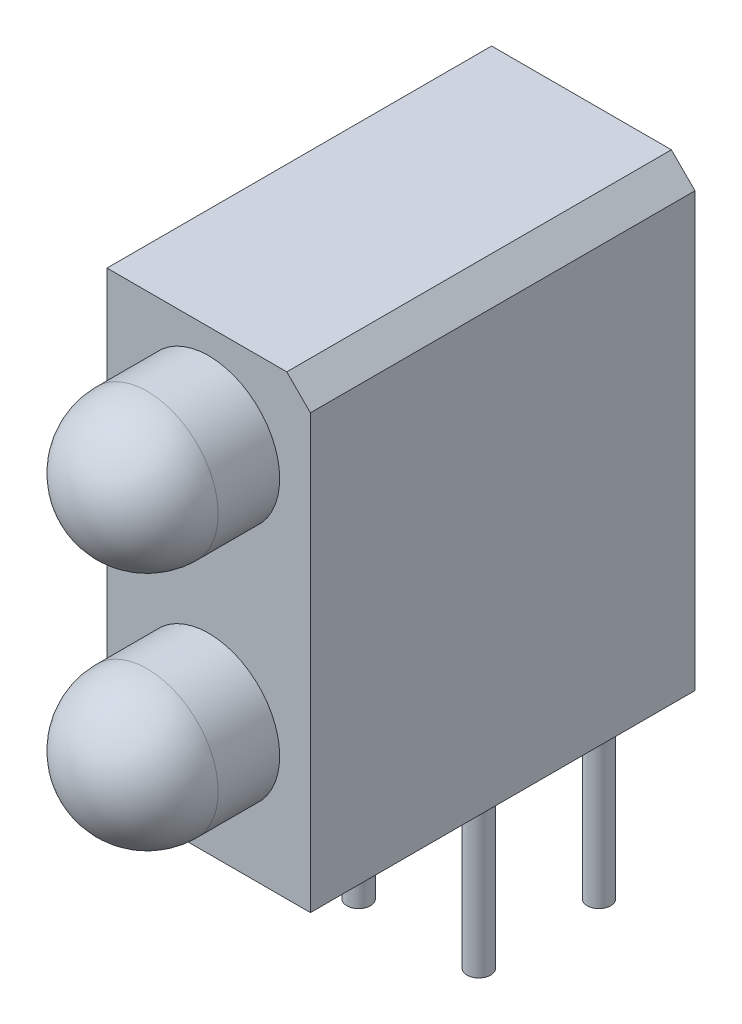
ISO-10303-21;
HEADER;
FILE_DESCRIPTION(('STEP AP214'),'2;1');
FILE_NAME('part.step','',(''),(''),'','','');
FILE_SCHEMA(('AUTOMOTIVE_DESIGN { 1 0 10303 214 1 1 1 1 }'));
ENDSEC;
DATA;
#1=APPLICATION_CONTEXT('core data for automotive mechanical design processes');
#2=APPLICATION_PROTOCOL_DEFINITION('international standard','automotive_design',2000,#1);
#3=PRODUCT_CONTEXT('',#1,'mechanical');
#4=PRODUCT('Part','Part','',(#3));
#5=PRODUCT_RELATED_PRODUCT_CATEGORY('part','',(#4));
#6=PRODUCT_DEFINITION_FORMATION('','',#4);
#7=PRODUCT_DEFINITION_CONTEXT('part definition',#1,'design');
#8=PRODUCT_DEFINITION('design','',#6,#7);
#9=PRODUCT_DEFINITION_SHAPE('','',#8);
#10=(LENGTH_UNIT() NAMED_UNIT(*) SI_UNIT(.MILLI.,.METRE.));
#11=(NAMED_UNIT(*) PLANE_ANGLE_UNIT() SI_UNIT($,.RADIAN.));
#12=(NAMED_UNIT(*) SI_UNIT($,.STERADIAN.) SOLID_ANGLE_UNIT());
#13=UNCERTAINTY_MEASURE_WITH_UNIT(LENGTH_MEASURE(1.E-05),#10,'distance_accuracy_value','');
#14=(GEOMETRIC_REPRESENTATION_CONTEXT(3) GLOBAL_UNCERTAINTY_ASSIGNED_CONTEXT((#13)) GLOBAL_UNIT_ASSIGNED_CONTEXT((#10,
#11,#12)) REPRESENTATION_CONTEXT('',''));
#15=CARTESIAN_POINT('',(0.,0.,0.));
#16=DIRECTION('',(0.,0.,1.));
#17=DIRECTION('',(1.,0.,0.));
#18=AXIS2_PLACEMENT_3D('',#15,#16,#17);
#19=CARTESIAN_POINT('',(0.,2.54,10.93));
#20=DIRECTION('',(0.,0.,-1.));
#21=DIRECTION('',(-1.,0.,0.));
#22=AXIS2_PLACEMENT_3D('',#19,#20,#21);
#23=CYLINDRICAL_SURFACE('',#22,1.5);
#24=CARTESIAN_POINT('',(0.,2.54,9.43));
#25=DIRECTION('',(0.,0.,-1.));
#26=DIRECTION('',(-1.,0.,0.));
#27=AXIS2_PLACEMENT_3D('',#24,#25,#26);
#28=CIRCLE('',#27,1.5);
#29=CARTESIAN_POINT('',(-1.5,2.54,9.43));
#30=VERTEX_POINT('',#29);
#31=EDGE_CURVE('E11',#30,#30,#28,.T.);
#32=ORIENTED_EDGE('',*,*,#31,.T.);
#33=EDGE_LOOP('',(#32));
#34=FACE_BOUND('',#33,.T.);
#35=CARTESIAN_POINT('',(0.,2.54,8.13));
#36=DIRECTION('',(0.,0.,1.));
#37=DIRECTION('',(1.,0.,0.));
#38=AXIS2_PLACEMENT_3D('',#35,#36,#37);
#39=CIRCLE('',#38,1.5);
#40=CARTESIAN_POINT('',(1.5,2.54,8.13));
#41=VERTEX_POINT('',#40);
#42=EDGE_CURVE('E49',#41,#41,#39,.T.);
#43=ORIENTED_EDGE('',*,*,#42,.T.);
#44=EDGE_LOOP('',(#43));
#45=FACE_BOUND('',#44,.T.);
#46=ADVANCED_FACE('F42',(#34,#45),#23,.T.);
#47=CARTESIAN_POINT('',(0.,2.54,8.13));
#48=DIRECTION('',(0.,0.,1.));
#49=DIRECTION('',(1.,0.,0.));
#50=AXIS2_PLACEMENT_3D('',#47,#48,#49);
#51=PLANE('',#50);
#52=ORIENTED_EDGE('',*,*,#42,.F.);
#53=EDGE_LOOP('',(#52));
#54=FACE_BOUND('',#53,.T.);
#55=ADVANCED_FACE('F56',(#54),#51,.F.);
#56=CARTESIAN_POINT('',(0.,2.54,9.43));
#57=DIRECTION('',(0.,0.,1.));
#58=DIRECTION('',(1.,0.,0.));
#59=AXIS2_PLACEMENT_3D('',#56,#57,#58);
#60=SPHERICAL_SURFACE('',#59,1.5);
#61=ORIENTED_EDGE('',*,*,#31,.F.);
#62=EDGE_LOOP('',(#61));
#63=FACE_BOUND('',#62,.T.);
#64=ADVANCED_FACE('F44',(#63),#60,.T.);
#65=CLOSED_SHELL('',(#46,#55,#64));
#66=MANIFOLD_SOLID_BREP('B2',#65);
#67=CARTESIAN_POINT('',(0.,7.62,10.93));
#68=DIRECTION('',(0.,0.,-1.));
#69=DIRECTION('',(-1.,0.,0.));
#70=AXIS2_PLACEMENT_3D('',#67,#68,#69);
#71=CYLINDRICAL_SURFACE('',#70,1.5);
#72=CARTESIAN_POINT('',(0.,7.62,9.43));
#73=DIRECTION('',(0.,0.,-1.));
#74=DIRECTION('',(-1.,0.,0.));
#75=AXIS2_PLACEMENT_3D('',#72,#73,#74);
#76=CIRCLE('',#75,1.5);
#77=CARTESIAN_POINT('',(-1.5,7.62,9.43));
#78=VERTEX_POINT('',#77);
#79=EDGE_CURVE('E41',#78,#78,#76,.T.);
#80=ORIENTED_EDGE('',*,*,#79,.T.);
#81=EDGE_LOOP('',(#80));
#82=FACE_BOUND('',#81,.T.);
#83=CARTESIAN_POINT('',(0.,7.62,8.13));
#84=DIRECTION('',(0.,0.,1.));
#85=DIRECTION('',(1.,0.,0.));
#86=AXIS2_PLACEMENT_3D('',#83,#84,#85);
#87=CIRCLE('',#86,1.5);
#88=CARTESIAN_POINT('',(1.5,7.62,8.13));
#89=VERTEX_POINT('',#88);
#90=EDGE_CURVE('E99',#89,#89,#87,.T.);
#91=ORIENTED_EDGE('',*,*,#90,.T.);
#92=EDGE_LOOP('',(#91));
#93=FACE_BOUND('',#92,.T.);
#94=ADVANCED_FACE('F92',(#82,#93),#71,.T.);
#95=CARTESIAN_POINT('',(0.,7.62,8.13));
#96=DIRECTION('',(0.,0.,1.));
#97=DIRECTION('',(1.,0.,0.));
#98=AXIS2_PLACEMENT_3D('',#95,#96,#97);
#99=PLANE('',#98);
#100=ORIENTED_EDGE('',*,*,#90,.F.);
#101=EDGE_LOOP('',(#100));
#102=FACE_BOUND('',#101,.T.);
#103=ADVANCED_FACE('F106',(#102),#99,.F.);
#104=CARTESIAN_POINT('',(0.,7.62,9.43));
#105=DIRECTION('',(0.,0.,1.));
#106=DIRECTION('',(1.,0.,0.));
#107=AXIS2_PLACEMENT_3D('',#104,#105,#106);
#108=SPHERICAL_SURFACE('',#107,1.5);
#109=ORIENTED_EDGE('',*,*,#79,.F.);
#110=EDGE_LOOP('',(#109));
#111=FACE_BOUND('',#110,.T.);
#112=ADVANCED_FACE('F94',(#111),#108,.T.);
#113=CLOSED_SHELL('',(#94,#103,#112));
#114=MANIFOLD_SOLID_BREP('B6',#113);
#115=CARTESIAN_POINT('',(-2.15,0.,8.13));
#116=DIRECTION('',(0.,1.,0.));
#117=DIRECTION('',(0.,0.,1.));
#118=AXIS2_PLACEMENT_3D('',#115,#116,#117);
#119=PLANE('',#118);
#120=CARTESIAN_POINT('',(-1.26999999999997,0.,1.15));
#121=DIRECTION('',(0.,1.,0.));
#122=DIRECTION('',(0.,0.,1.));
#123=AXIS2_PLACEMENT_3D('',#120,#121,#122);
#124=CIRCLE('',#123,0.25);
#125=CARTESIAN_POINT('',(-1.26999999999997,0.,1.4));
#126=VERTEX_POINT('',#125);
#127=EDGE_CURVE('E141',#126,#126,#124,.F.);
#128=ORIENTED_EDGE('',*,*,#127,.F.);
#129=EDGE_LOOP('',(#128));
#130=FACE_BOUND('',#129,.T.);
#131=CARTESIAN_POINT('',(-1.27,0.,3.69));
#132=DIRECTION('',(0.,1.,0.));
#133=DIRECTION('',(0.,0.,1.));
#134=AXIS2_PLACEMENT_3D('',#131,#132,#133);
#135=CIRCLE('',#134,0.25);
#136=CARTESIAN_POINT('',(-1.27,0.,3.94));
#137=VERTEX_POINT('',#136);
#138=EDGE_CURVE('E218',#137,#137,#135,.F.);
#139=ORIENTED_EDGE('',*,*,#138,.F.);
#140=EDGE_LOOP('',(#139));
#141=FACE_BOUND('',#140,.T.);
#142=DIRECTION('',(1.,0.,0.));
#143=VECTOR('',#142,1.);
#144=CARTESIAN_POINT('',(-2.15,0.,0.));
#145=LINE('',#144,#143);
#146=CARTESIAN_POINT('',(-2.15,0.,0.));
#147=VERTEX_POINT('',#146);
#148=CARTESIAN_POINT('',(2.15,0.,0.));
#149=VERTEX_POINT('',#148);
#150=EDGE_CURVE('E377',#147,#149,#145,.T.);
#151=ORIENTED_EDGE('',*,*,#150,.T.);
#152=DIRECTION('',(0.,0.,-1.));
#153=VECTOR('',#152,1.);
#154=CARTESIAN_POINT('',(2.15,0.,8.13));
#155=LINE('',#154,#153);
#156=CARTESIAN_POINT('',(2.15,0.,8.13));
#157=VERTEX_POINT('',#156);
#158=EDGE_CURVE('E189',#157,#149,#155,.T.);
#159=ORIENTED_EDGE('',*,*,#158,.F.);
#160=DIRECTION('',(1.,0.,0.));
#161=VECTOR('',#160,1.);
#162=CARTESIAN_POINT('',(-2.15,0.,8.13));
#163=LINE('',#162,#161);
#164=CARTESIAN_POINT('',(-2.15,0.,8.13));
#165=VERTEX_POINT('',#164);
#166=EDGE_CURVE('E182',#165,#157,#163,.T.);
#167=ORIENTED_EDGE('',*,*,#166,.F.);
#168=DIRECTION('',(0.,0.,-1.));
#169=VECTOR('',#168,1.);
#170=CARTESIAN_POINT('',(-2.15,0.,8.13));
#171=LINE('',#170,#169);
#172=EDGE_CURVE('E186',#165,#147,#171,.T.);
#173=ORIENTED_EDGE('',*,*,#172,.T.);
#174=EDGE_LOOP('',(#151,#159,#167,#173));
#175=FACE_BOUND('',#174,.T.);
#176=CARTESIAN_POINT('',(1.27,0.,3.69));
#177=DIRECTION('',(0.,1.,0.));
#178=DIRECTION('',(0.,0.,1.));
#179=AXIS2_PLACEMENT_3D('',#176,#177,#178);
#180=CIRCLE('',#179,0.25);
#181=CARTESIAN_POINT('',(1.27,0.,3.94));
#182=VERTEX_POINT('',#181);
#183=EDGE_CURVE('E221',#182,#182,#180,.F.);
#184=ORIENTED_EDGE('',*,*,#183,.F.);
#185=EDGE_LOOP('',(#184));
#186=FACE_BOUND('',#185,.T.);
#187=CARTESIAN_POINT('',(1.27000000000003,0.,1.15));
#188=DIRECTION('',(0.,1.,0.));
#189=DIRECTION('',(0.,0.,1.));
#190=AXIS2_PLACEMENT_3D('',#187,#188,#189);
#191=CIRCLE('',#190,0.25);
#192=CARTESIAN_POINT('',(1.27000000000003,0.,1.4));
#193=VERTEX_POINT('',#192);
#194=EDGE_CURVE('E90',#193,#193,#191,.F.);
#195=ORIENTED_EDGE('',*,*,#194,.F.);
#196=EDGE_LOOP('',(#195));
#197=FACE_BOUND('',#196,.T.);
#198=ADVANCED_FACE('F133',(#130,#141,#175,#186,#197),#119,.F.);
#199=CARTESIAN_POINT('',(-2.15,0.,8.13));
#200=DIRECTION('',(1.,0.,0.));
#201=DIRECTION('',(0.,0.,-1.));
#202=AXIS2_PLACEMENT_3D('',#199,#200,#201);
#203=PLANE('',#202);
#204=DIRECTION('',(0.,-1.,0.));
#205=VECTOR('',#204,1.);
#206=CARTESIAN_POINT('',(-2.15,0.,0.));
#207=LINE('',#206,#205);
#208=CARTESIAN_POINT('',(-2.15,9.65,0.));
#209=VERTEX_POINT('',#208);
#210=EDGE_CURVE('E205',#209,#147,#207,.T.);
#211=ORIENTED_EDGE('',*,*,#210,.T.);
#212=ORIENTED_EDGE('',*,*,#172,.F.);
#213=DIRECTION('',(0.,-1.,0.));
#214=VECTOR('',#213,1.);
#215=CARTESIAN_POINT('',(-2.15,0.,8.13));
#216=LINE('',#215,#214);
#217=CARTESIAN_POINT('',(-2.15,9.65,8.13));
#218=VERTEX_POINT('',#217);
#219=EDGE_CURVE('E192',#218,#165,#216,.T.);
#220=ORIENTED_EDGE('',*,*,#219,.F.);
#221=DIRECTION('',(0.,0.,-1.));
#222=VECTOR('',#221,1.);
#223=CARTESIAN_POINT('',(-2.15,9.65,8.13));
#224=LINE('',#223,#222);
#225=EDGE_CURVE('E210',#218,#209,#224,.T.);
#226=ORIENTED_EDGE('',*,*,#225,.T.);
#227=EDGE_LOOP('',(#211,#212,#220,#226));
#228=FACE_BOUND('',#227,.T.);
#229=ADVANCED_FACE('F203',(#228),#203,.F.);
#230=CARTESIAN_POINT('',(2.15,0.,8.13));
#231=DIRECTION('',(-1.,0.,0.));
#232=DIRECTION('',(0.,0.,1.));
#233=AXIS2_PLACEMENT_3D('',#230,#231,#232);
#234=PLANE('',#233);
#235=DIRECTION('',(0.,1.,0.));
#236=VECTOR('',#235,1.);
#237=CARTESIAN_POINT('',(2.15,0.,0.));
#238=LINE('',#237,#236);
#239=CARTESIAN_POINT('',(2.15,9.15,0.));
#240=VERTEX_POINT('',#239);
#241=EDGE_CURVE('E379',#149,#240,#238,.T.);
#242=ORIENTED_EDGE('',*,*,#241,.T.);
#243=DIRECTION('',(0.,0.,1.));
#244=VECTOR('',#243,1.);
#245=CARTESIAN_POINT('',(2.15,9.15,8.13));
#246=LINE('',#245,#244);
#247=CARTESIAN_POINT('',(2.15,9.15,8.13));
#248=VERTEX_POINT('',#247);
#249=EDGE_CURVE('E148',#240,#248,#246,.T.);
#250=ORIENTED_EDGE('',*,*,#249,.T.);
#251=DIRECTION('',(0.,1.,0.));
#252=VECTOR('',#251,1.);
#253=CARTESIAN_POINT('',(2.15,0.,8.13));
#254=LINE('',#253,#252);
#255=EDGE_CURVE('E191',#157,#248,#254,.T.);
#256=ORIENTED_EDGE('',*,*,#255,.F.);
#257=ORIENTED_EDGE('',*,*,#158,.T.);
#258=EDGE_LOOP('',(#242,#250,#256,#257));
#259=FACE_BOUND('',#258,.T.);
#260=ADVANCED_FACE('F257',(#259),#234,.F.);
#261=CARTESIAN_POINT('',(-2.15,9.65,8.13));
#262=DIRECTION('',(0.,-1.,0.));
#263=DIRECTION('',(0.,0.,-1.));
#264=AXIS2_PLACEMENT_3D('',#261,#262,#263);
#265=PLANE('',#264);
#266=DIRECTION('',(-1.,0.,0.));
#267=VECTOR('',#266,1.);
#268=CARTESIAN_POINT('',(-2.15,9.65,8.13));
#269=LINE('',#268,#267);
#270=CARTESIAN_POINT('',(1.65,9.65,8.13));
#271=VERTEX_POINT('',#270);
#272=EDGE_CURVE('E197',#271,#218,#269,.T.);
#273=ORIENTED_EDGE('',*,*,#272,.F.);
#274=DIRECTION('',(0.,0.,-1.));
#275=VECTOR('',#274,1.);
#276=CARTESIAN_POINT('',(1.65,9.65,8.13));
#277=LINE('',#276,#275);
#278=CARTESIAN_POINT('',(1.65,9.65,0.));
#279=VERTEX_POINT('',#278);
#280=EDGE_CURVE('E206',#271,#279,#277,.T.);
#281=ORIENTED_EDGE('',*,*,#280,.T.);
#282=DIRECTION('',(-1.,0.,0.));
#283=VECTOR('',#282,1.);
#284=CARTESIAN_POINT('',(-2.15,9.65,0.));
#285=LINE('',#284,#283);
#286=EDGE_CURVE('E201',#279,#209,#285,.T.);
#287=ORIENTED_EDGE('',*,*,#286,.T.);
#288=ORIENTED_EDGE('',*,*,#225,.F.);
#289=EDGE_LOOP('',(#273,#281,#287,#288));
#290=FACE_BOUND('',#289,.T.);
#291=ADVANCED_FACE('F252',(#290),#265,.F.);
#292=CARTESIAN_POINT('',(0.,0.,8.13));
#293=DIRECTION('',(0.,0.,-1.));
#294=DIRECTION('',(-1.,0.,0.));
#295=AXIS2_PLACEMENT_3D('',#292,#293,#294);
#296=PLANE('',#295);
#297=ORIENTED_EDGE('',*,*,#255,.T.);
#298=DIRECTION('',(0.707106781186546,-0.707106781186549,0.));
#299=VECTOR('',#298,1.);
#300=CARTESIAN_POINT('',(1.65,9.65,8.13));
#301=LINE('',#300,#299);
#302=EDGE_CURVE('E216',#248,#271,#301,.F.);
#303=ORIENTED_EDGE('',*,*,#302,.T.);
#304=ORIENTED_EDGE('',*,*,#272,.T.);
#305=ORIENTED_EDGE('',*,*,#219,.T.);
#306=ORIENTED_EDGE('',*,*,#166,.T.);
#307=EDGE_LOOP('',(#297,#303,#304,#305,#306));
#308=FACE_BOUND('',#307,.T.);
#309=ADVANCED_FACE('F195',(#308),#296,.F.);
#310=CARTESIAN_POINT('',(0.,0.,0.));
#311=DIRECTION('',(0.,0.,-1.));
#312=DIRECTION('',(-1.,0.,0.));
#313=AXIS2_PLACEMENT_3D('',#310,#311,#312);
#314=PLANE('',#313);
#315=ORIENTED_EDGE('',*,*,#286,.F.);
#316=DIRECTION('',(-0.707106781186546,0.707106781186549,0.));
#317=VECTOR('',#316,1.);
#318=CARTESIAN_POINT('',(5.65,5.64999999999998,0.));
#319=LINE('',#318,#317);
#320=EDGE_CURVE('E156',#279,#240,#319,.F.);
#321=ORIENTED_EDGE('',*,*,#320,.T.);
#322=ORIENTED_EDGE('',*,*,#241,.F.);
#323=ORIENTED_EDGE('',*,*,#150,.F.);
#324=ORIENTED_EDGE('',*,*,#210,.F.);
#325=EDGE_LOOP('',(#315,#321,#322,#323,#324));
#326=FACE_BOUND('',#325,.T.);
#327=ADVANCED_FACE('F245',(#326),#314,.T.);
#328=CARTESIAN_POINT('',(1.65,9.65,8.13));
#329=DIRECTION('',(-0.707106781186549,-0.707106781186546,0.));
#330=DIRECTION('',(0.,0.,-1.));
#331=AXIS2_PLACEMENT_3D('',#328,#329,#330);
#332=PLANE('',#331);
#333=ORIENTED_EDGE('',*,*,#302,.F.);
#334=ORIENTED_EDGE('',*,*,#249,.F.);
#335=ORIENTED_EDGE('',*,*,#320,.F.);
#336=ORIENTED_EDGE('',*,*,#280,.F.);
#337=EDGE_LOOP('',(#333,#334,#335,#336));
#338=FACE_BOUND('',#337,.T.);
#339=ADVANCED_FACE('F135',(#338),#332,.F.);
#340=CARTESIAN_POINT('',(-1.27,-3.68,3.69));
#341=DIRECTION('',(0.,1.,0.));
#342=DIRECTION('',(0.,0.,1.));
#343=AXIS2_PLACEMENT_3D('',#340,#341,#342);
#344=CYLINDRICAL_SURFACE('',#343,0.25);
#345=CARTESIAN_POINT('',(-1.27,-3.68,3.69));
#346=DIRECTION('',(0.,-1.,0.));
#347=DIRECTION('',(0.,0.,-1.));
#348=AXIS2_PLACEMENT_3D('',#345,#346,#347);
#349=CIRCLE('',#348,0.25);
#350=CARTESIAN_POINT('',(-1.27,-3.68,3.44));
#351=VERTEX_POINT('',#350);
#352=EDGE_CURVE('E371',#351,#351,#349,.T.);
#353=ORIENTED_EDGE('',*,*,#352,.F.);
#354=EDGE_LOOP('',(#353));
#355=FACE_BOUND('',#354,.T.);
#356=ORIENTED_EDGE('',*,*,#138,.T.);
#357=EDGE_LOOP('',(#356));
#358=FACE_BOUND('',#357,.T.);
#359=ADVANCED_FACE('F233',(#355,#358),#344,.T.);
#360=CARTESIAN_POINT('',(-1.27,-3.68,3.69));
#361=DIRECTION('',(0.,-1.,0.));
#362=DIRECTION('',(0.,0.,-1.));
#363=AXIS2_PLACEMENT_3D('',#360,#361,#362);
#364=PLANE('',#363);
#365=ORIENTED_EDGE('',*,*,#352,.T.);
#366=EDGE_LOOP('',(#365));
#367=FACE_BOUND('',#366,.T.);
#368=ADVANCED_FACE('F235',(#367),#364,.T.);
#369=CARTESIAN_POINT('',(1.27,-3.68,3.69));
#370=DIRECTION('',(0.,1.,0.));
#371=DIRECTION('',(0.,0.,1.));
#372=AXIS2_PLACEMENT_3D('',#369,#370,#371);
#373=CYLINDRICAL_SURFACE('',#372,0.25);
#374=CARTESIAN_POINT('',(1.27,-3.68,3.69));
#375=DIRECTION('',(0.,-1.,0.));
#376=DIRECTION('',(0.,0.,1.));
#377=AXIS2_PLACEMENT_3D('',#374,#375,#376);
#378=CIRCLE('',#377,0.25);
#379=CARTESIAN_POINT('',(1.27,-3.68,3.94));
#380=VERTEX_POINT('',#379);
#381=EDGE_CURVE('E366',#380,#380,#378,.T.);
#382=ORIENTED_EDGE('',*,*,#381,.F.);
#383=EDGE_LOOP('',(#382));
#384=FACE_BOUND('',#383,.T.);
#385=ORIENTED_EDGE('',*,*,#183,.T.);
#386=EDGE_LOOP('',(#385));
#387=FACE_BOUND('',#386,.T.);
#388=ADVANCED_FACE('F242',(#384,#387),#373,.T.);
#389=CARTESIAN_POINT('',(1.27,-3.68,3.69));
#390=DIRECTION('',(0.,1.,0.));
#391=DIRECTION('',(0.,0.,1.));
#392=AXIS2_PLACEMENT_3D('',#389,#390,#391);
#393=PLANE('',#392);
#394=ORIENTED_EDGE('',*,*,#381,.T.);
#395=EDGE_LOOP('',(#394));
#396=FACE_BOUND('',#395,.T.);
#397=ADVANCED_FACE('F308',(#396),#393,.F.);
#398=CARTESIAN_POINT('',(-1.26999999999997,-3.68,1.15));
#399=DIRECTION('',(0.,1.,0.));
#400=DIRECTION('',(0.,0.,1.));
#401=AXIS2_PLACEMENT_3D('',#398,#399,#400);
#402=CYLINDRICAL_SURFACE('',#401,0.25);
#403=CARTESIAN_POINT('',(-1.26999999999997,-3.68,1.15));
#404=DIRECTION('',(0.,-1.,0.));
#405=DIRECTION('',(0.,0.,-1.));
#406=AXIS2_PLACEMENT_3D('',#403,#404,#405);
#407=CIRCLE('',#406,0.25);
#408=CARTESIAN_POINT('',(-1.26999999999997,-3.68,0.9));
#409=VERTEX_POINT('',#408);
#410=EDGE_CURVE('E363',#409,#409,#407,.T.);
#411=ORIENTED_EDGE('',*,*,#410,.F.);
#412=EDGE_LOOP('',(#411));
#413=FACE_BOUND('',#412,.T.);
#414=ORIENTED_EDGE('',*,*,#127,.T.);
#415=EDGE_LOOP('',(#414));
#416=FACE_BOUND('',#415,.T.);
#417=ADVANCED_FACE('F226',(#413,#416),#402,.T.);
#418=CARTESIAN_POINT('',(-1.26999999999997,-3.68,1.15));
#419=DIRECTION('',(0.,-1.,0.));
#420=DIRECTION('',(0.,0.,-1.));
#421=AXIS2_PLACEMENT_3D('',#418,#419,#420);
#422=PLANE('',#421);
#423=ORIENTED_EDGE('',*,*,#410,.T.);
#424=EDGE_LOOP('',(#423));
#425=FACE_BOUND('',#424,.T.);
#426=ADVANCED_FACE('F326',(#425),#422,.T.);
#427=CARTESIAN_POINT('',(1.27000000000003,-3.68,1.15));
#428=DIRECTION('',(0.,1.,0.));
#429=DIRECTION('',(0.,0.,1.));
#430=AXIS2_PLACEMENT_3D('',#427,#428,#429);
#431=CYLINDRICAL_SURFACE('',#430,0.25);
#432=CARTESIAN_POINT('',(1.27000000000003,-3.68,1.15));
#433=DIRECTION('',(0.,-1.,0.));
#434=DIRECTION('',(0.,0.,1.));
#435=AXIS2_PLACEMENT_3D('',#432,#433,#434);
#436=CIRCLE('',#435,0.25);
#437=CARTESIAN_POINT('',(1.27000000000003,-3.68,1.4));
#438=VERTEX_POINT('',#437);
#439=EDGE_CURVE('E362',#438,#438,#436,.T.);
#440=ORIENTED_EDGE('',*,*,#439,.F.);
#441=EDGE_LOOP('',(#440));
#442=FACE_BOUND('',#441,.T.);
#443=ORIENTED_EDGE('',*,*,#194,.T.);
#444=EDGE_LOOP('',(#443));
#445=FACE_BOUND('',#444,.T.);
#446=ADVANCED_FACE('F336',(#442,#445),#431,.T.);
#447=CARTESIAN_POINT('',(1.27000000000003,-3.68,1.15));
#448=DIRECTION('',(0.,1.,0.));
#449=DIRECTION('',(0.,0.,1.));
#450=AXIS2_PLACEMENT_3D('',#447,#448,#449);
#451=PLANE('',#450);
#452=ORIENTED_EDGE('',*,*,#439,.T.);
#453=EDGE_LOOP('',(#452));
#454=FACE_BOUND('',#453,.T.);
#455=ADVANCED_FACE('F346',(#454),#451,.F.);
#456=CLOSED_SHELL('',(#198,#229,#260,#291,#309,#327,#339,#359,#368,#388,#397,#417,#426,#446,#455));
#457=MANIFOLD_SOLID_BREP('B36',#456);
#458=ADVANCED_BREP_SHAPE_REPRESENTATION('',(#18,#66,#114,#457),#14);
#459=SHAPE_DEFINITION_REPRESENTATION(#9,#458);
ENDSEC;
END-ISO-10303-21;
